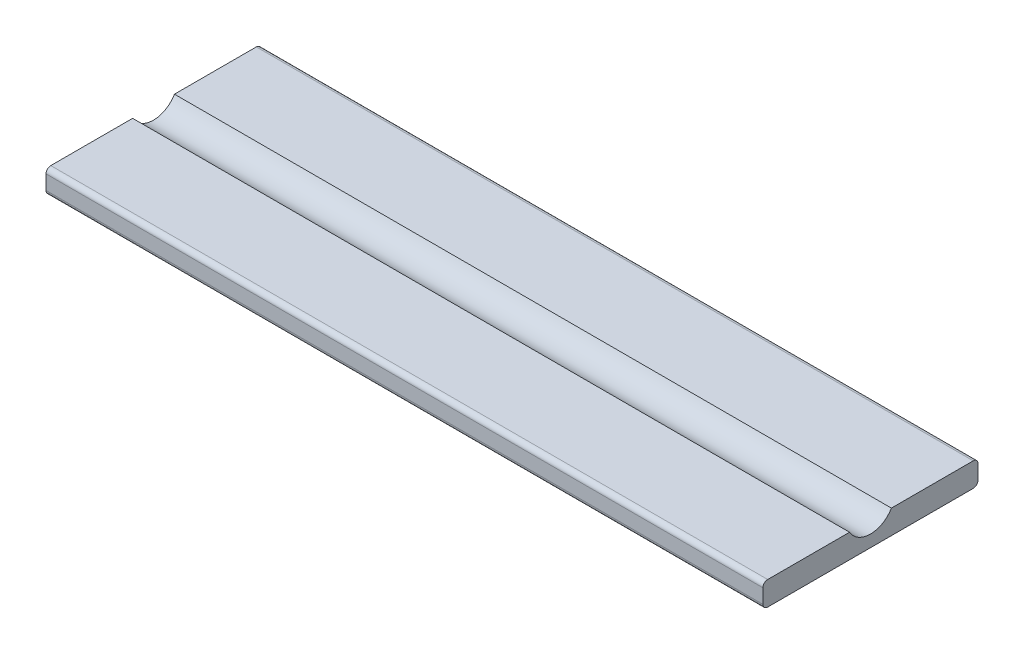
ISO-10303-21;
HEADER;
FILE_DESCRIPTION(('STEP AP214'),'2;1');
FILE_NAME('part.step','',(''),(''),'','','');
FILE_SCHEMA(('AUTOMOTIVE_DESIGN { 1 0 10303 214 1 1 1 1 }'));
ENDSEC;
DATA;
#1=APPLICATION_CONTEXT('core data for automotive mechanical design processes');
#2=APPLICATION_PROTOCOL_DEFINITION('international standard','automotive_design',2000,#1);
#3=PRODUCT_CONTEXT('',#1,'mechanical');
#4=PRODUCT('Part','Part','',(#3));
#5=PRODUCT_RELATED_PRODUCT_CATEGORY('part','',(#4));
#6=PRODUCT_DEFINITION_FORMATION('','',#4);
#7=PRODUCT_DEFINITION_CONTEXT('part definition',#1,'design');
#8=PRODUCT_DEFINITION('design','',#6,#7);
#9=PRODUCT_DEFINITION_SHAPE('','',#8);
#10=(LENGTH_UNIT() NAMED_UNIT(*) SI_UNIT(.MILLI.,.METRE.));
#11=(NAMED_UNIT(*) PLANE_ANGLE_UNIT() SI_UNIT($,.RADIAN.));
#12=(NAMED_UNIT(*) SI_UNIT($,.STERADIAN.) SOLID_ANGLE_UNIT());
#13=UNCERTAINTY_MEASURE_WITH_UNIT(LENGTH_MEASURE(1.E-05),#10,'distance_accuracy_value','');
#14=(GEOMETRIC_REPRESENTATION_CONTEXT(3) GLOBAL_UNCERTAINTY_ASSIGNED_CONTEXT((#13)) GLOBAL_UNIT_ASSIGNED_CONTEXT((#10,
#11,#12)) REPRESENTATION_CONTEXT('',''));
#15=CARTESIAN_POINT('',(0.,0.,0.));
#16=DIRECTION('',(0.,0.,1.));
#17=DIRECTION('',(1.,0.,0.));
#18=AXIS2_PLACEMENT_3D('',#15,#16,#17);
#19=CARTESIAN_POINT('',(47.625,0.,14.2875));
#20=DIRECTION('',(0.,0.,-1.));
#21=DIRECTION('',(-1.,0.,0.));
#22=AXIS2_PLACEMENT_3D('',#19,#20,#21);
#23=PLANE('',#22);
#24=DIRECTION('',(0.,-1.,0.));
#25=VECTOR('',#24,1.);
#26=CARTESIAN_POINT('',(-47.625,0.,14.2875));
#27=LINE('',#26,#25);
#28=CARTESIAN_POINT('',(-47.625,2.54,14.2875));
#29=VERTEX_POINT('',#28);
#30=CARTESIAN_POINT('',(-47.625,0.635,14.2875));
#31=VERTEX_POINT('',#30);
#32=EDGE_CURVE('E139',#29,#31,#27,.T.);
#33=ORIENTED_EDGE('',*,*,#32,.T.);
#34=DIRECTION('',(-1.,0.,0.));
#35=VECTOR('',#34,1.);
#36=CARTESIAN_POINT('',(47.625,0.635,14.2875));
#37=LINE('',#36,#35);
#38=CARTESIAN_POINT('',(47.625,0.635,14.2875));
#39=VERTEX_POINT('',#38);
#40=EDGE_CURVE('E43',#31,#39,#37,.F.);
#41=ORIENTED_EDGE('',*,*,#40,.T.);
#42=DIRECTION('',(0.,-1.,0.));
#43=VECTOR('',#42,1.);
#44=CARTESIAN_POINT('',(47.625,0.,14.2875));
#45=LINE('',#44,#43);
#46=CARTESIAN_POINT('',(47.625,2.54,14.2875));
#47=VERTEX_POINT('',#46);
#48=EDGE_CURVE('E153',#47,#39,#45,.T.);
#49=ORIENTED_EDGE('',*,*,#48,.F.);
#50=DIRECTION('',(-1.,0.,0.));
#51=VECTOR('',#50,1.);
#52=CARTESIAN_POINT('',(47.625,2.54,14.2875));
#53=LINE('',#52,#51);
#54=EDGE_CURVE('E181',#47,#29,#53,.T.);
#55=ORIENTED_EDGE('',*,*,#54,.T.);
#56=EDGE_LOOP('',(#33,#41,#49,#55));
#57=FACE_BOUND('',#56,.T.);
#58=ADVANCED_FACE('F35',(#57),#23,.F.);
#59=CARTESIAN_POINT('',(47.625,0.,14.2875));
#60=DIRECTION('',(0.,1.,0.));
#61=DIRECTION('',(0.,0.,1.));
#62=AXIS2_PLACEMENT_3D('',#59,#60,#61);
#63=PLANE('',#62);
#64=DIRECTION('',(0.,0.,-1.));
#65=VECTOR('',#64,1.);
#66=CARTESIAN_POINT('',(-47.625,0.,14.2875));
#67=LINE('',#66,#65);
#68=CARTESIAN_POINT('',(-47.625,0.,13.6525));
#69=VERTEX_POINT('',#68);
#70=CARTESIAN_POINT('',(-47.625,0.,-13.6525));
#71=VERTEX_POINT('',#70);
#72=EDGE_CURVE('E142',#69,#71,#67,.T.);
#73=ORIENTED_EDGE('',*,*,#72,.T.);
#74=DIRECTION('',(-1.,0.,0.));
#75=VECTOR('',#74,1.);
#76=CARTESIAN_POINT('',(47.625,0.,-13.6525));
#77=LINE('',#76,#75);
#78=CARTESIAN_POINT('',(47.625,0.,-13.6525));
#79=VERTEX_POINT('',#78);
#80=EDGE_CURVE('E170',#71,#79,#77,.F.);
#81=ORIENTED_EDGE('',*,*,#80,.T.);
#82=DIRECTION('',(0.,0.,-1.));
#83=VECTOR('',#82,1.);
#84=CARTESIAN_POINT('',(47.625,0.,14.2875));
#85=LINE('',#84,#83);
#86=CARTESIAN_POINT('',(47.625,0.,13.6525));
#87=VERTEX_POINT('',#86);
#88=EDGE_CURVE('E193',#87,#79,#85,.T.);
#89=ORIENTED_EDGE('',*,*,#88,.F.);
#90=DIRECTION('',(-1.,0.,0.));
#91=VECTOR('',#90,1.);
#92=CARTESIAN_POINT('',(47.625,0.,13.6525));
#93=LINE('',#92,#91);
#94=EDGE_CURVE('E167',#87,#69,#93,.T.);
#95=ORIENTED_EDGE('',*,*,#94,.T.);
#96=EDGE_LOOP('',(#73,#81,#89,#95));
#97=FACE_BOUND('',#96,.T.);
#98=ADVANCED_FACE('F199',(#97),#63,.F.);
#99=CARTESIAN_POINT('',(47.625,0.,-14.2875));
#100=DIRECTION('',(0.,0.,1.));
#101=DIRECTION('',(1.,0.,0.));
#102=AXIS2_PLACEMENT_3D('',#99,#100,#101);
#103=PLANE('',#102);
#104=DIRECTION('',(0.,1.,0.));
#105=VECTOR('',#104,1.);
#106=CARTESIAN_POINT('',(47.625,0.,-14.2875));
#107=LINE('',#106,#105);
#108=CARTESIAN_POINT('',(47.625,0.635,-14.2875));
#109=VERTEX_POINT('',#108);
#110=CARTESIAN_POINT('',(47.625,2.54,-14.2875));
#111=VERTEX_POINT('',#110);
#112=EDGE_CURVE('E120',#109,#111,#107,.T.);
#113=ORIENTED_EDGE('',*,*,#112,.F.);
#114=DIRECTION('',(-1.,0.,0.));
#115=VECTOR('',#114,1.);
#116=CARTESIAN_POINT('',(47.625,0.635,-14.2875));
#117=LINE('',#116,#115);
#118=CARTESIAN_POINT('',(-47.625,0.635,-14.2875));
#119=VERTEX_POINT('',#118);
#120=EDGE_CURVE('E156',#109,#119,#117,.T.);
#121=ORIENTED_EDGE('',*,*,#120,.T.);
#122=DIRECTION('',(0.,1.,0.));
#123=VECTOR('',#122,1.);
#124=CARTESIAN_POINT('',(-47.625,0.,-14.2875));
#125=LINE('',#124,#123);
#126=CARTESIAN_POINT('',(-47.625,2.54,-14.2875));
#127=VERTEX_POINT('',#126);
#128=EDGE_CURVE('E145',#119,#127,#125,.T.);
#129=ORIENTED_EDGE('',*,*,#128,.T.);
#130=DIRECTION('',(-1.,0.,0.));
#131=VECTOR('',#130,1.);
#132=CARTESIAN_POINT('',(47.625,2.54,-14.2875));
#133=LINE('',#132,#131);
#134=EDGE_CURVE('E129',#127,#111,#133,.F.);
#135=ORIENTED_EDGE('',*,*,#134,.T.);
#136=EDGE_LOOP('',(#113,#121,#129,#135));
#137=FACE_BOUND('',#136,.T.);
#138=ADVANCED_FACE('F210',(#137),#103,.F.);
#139=CARTESIAN_POINT('',(47.625,3.175,-2.778125));
#140=DIRECTION('',(0.,-1.,0.));
#141=DIRECTION('',(0.,0.,-1.));
#142=AXIS2_PLACEMENT_3D('',#139,#140,#141);
#143=PLANE('',#142);
#144=DIRECTION('',(0.,0.,1.));
#145=VECTOR('',#144,1.);
#146=CARTESIAN_POINT('',(47.625,3.175,-2.778125));
#147=LINE('',#146,#145);
#148=CARTESIAN_POINT('',(47.625,3.175,-13.6525));
#149=VERTEX_POINT('',#148);
#150=CARTESIAN_POINT('',(47.625,3.175,-2.778125));
#151=VERTEX_POINT('',#150);
#152=EDGE_CURVE('E110',#149,#151,#147,.T.);
#153=ORIENTED_EDGE('',*,*,#152,.F.);
#154=DIRECTION('',(-1.,0.,0.));
#155=VECTOR('',#154,1.);
#156=CARTESIAN_POINT('',(47.625,3.175,-13.6525));
#157=LINE('',#156,#155);
#158=CARTESIAN_POINT('',(-47.625,3.175,-13.6525));
#159=VERTEX_POINT('',#158);
#160=EDGE_CURVE('E179',#149,#159,#157,.T.);
#161=ORIENTED_EDGE('',*,*,#160,.T.);
#162=DIRECTION('',(0.,0.,1.));
#163=VECTOR('',#162,1.);
#164=CARTESIAN_POINT('',(-47.625,3.175,-2.778125));
#165=LINE('',#164,#163);
#166=CARTESIAN_POINT('',(-47.625,3.175,-2.778125));
#167=VERTEX_POINT('',#166);
#168=EDGE_CURVE('E126',#159,#167,#165,.T.);
#169=ORIENTED_EDGE('',*,*,#168,.T.);
#170=DIRECTION('',(-1.,0.,0.));
#171=VECTOR('',#170,1.);
#172=CARTESIAN_POINT('',(47.625,3.175,-2.778125));
#173=LINE('',#172,#171);
#174=EDGE_CURVE('E123',#151,#167,#173,.T.);
#175=ORIENTED_EDGE('',*,*,#174,.F.);
#176=EDGE_LOOP('',(#153,#161,#169,#175));
#177=FACE_BOUND('',#176,.T.);
#178=ADVANCED_FACE('F124',(#177),#143,.F.);
#179=CARTESIAN_POINT('',(47.625,4.78646684027778,0.));
#180=DIRECTION('',(-1.,0.,0.));
#181=DIRECTION('',(0.,0.,1.));
#182=AXIS2_PLACEMENT_3D('',#179,#180,#181);
#183=CYLINDRICAL_SURFACE('',#182,3.21166684027778);
#184=CARTESIAN_POINT('',(-47.625,4.78646684027778,0.));
#185=DIRECTION('',(-1.,0.,0.));
#186=DIRECTION('',(0.,0.,-1.));
#187=AXIS2_PLACEMENT_3D('',#184,#185,#186);
#188=CIRCLE('',#187,3.21166684027778);
#189=CARTESIAN_POINT('',(-47.625,3.175,2.778125));
#190=VERTEX_POINT('',#189);
#191=EDGE_CURVE('E149',#167,#190,#188,.T.);
#192=ORIENTED_EDGE('',*,*,#191,.T.);
#193=DIRECTION('',(-1.,0.,0.));
#194=VECTOR('',#193,1.);
#195=CARTESIAN_POINT('',(47.625,3.175,2.778125));
#196=LINE('',#195,#194);
#197=CARTESIAN_POINT('',(47.625,3.175,2.778125));
#198=VERTEX_POINT('',#197);
#199=EDGE_CURVE('E130',#198,#190,#196,.T.);
#200=ORIENTED_EDGE('',*,*,#199,.F.);
#201=CARTESIAN_POINT('',(47.625,4.78646684027778,0.));
#202=DIRECTION('',(-1.,0.,0.));
#203=DIRECTION('',(0.,0.,-1.));
#204=AXIS2_PLACEMENT_3D('',#201,#202,#203);
#205=CIRCLE('',#204,3.21166684027778);
#206=EDGE_CURVE('E115',#151,#198,#205,.T.);
#207=ORIENTED_EDGE('',*,*,#206,.F.);
#208=ORIENTED_EDGE('',*,*,#174,.T.);
#209=EDGE_LOOP('',(#192,#200,#207,#208));
#210=FACE_BOUND('',#209,.T.);
#211=ADVANCED_FACE('F132',(#210),#183,.F.);
#212=CARTESIAN_POINT('',(47.625,3.175,14.2875));
#213=DIRECTION('',(0.,-1.,0.));
#214=DIRECTION('',(0.,0.,-1.));
#215=AXIS2_PLACEMENT_3D('',#212,#213,#214);
#216=PLANE('',#215);
#217=DIRECTION('',(0.,0.,1.));
#218=VECTOR('',#217,1.);
#219=CARTESIAN_POINT('',(-47.625,3.175,14.2875));
#220=LINE('',#219,#218);
#221=CARTESIAN_POINT('',(-47.625,3.175,13.6525));
#222=VERTEX_POINT('',#221);
#223=EDGE_CURVE('E151',#190,#222,#220,.T.);
#224=ORIENTED_EDGE('',*,*,#223,.T.);
#225=DIRECTION('',(-1.,0.,0.));
#226=VECTOR('',#225,1.);
#227=CARTESIAN_POINT('',(47.625,3.175,13.6525));
#228=LINE('',#227,#226);
#229=CARTESIAN_POINT('',(47.625,3.175,13.6525));
#230=VERTEX_POINT('',#229);
#231=EDGE_CURVE('E11',#222,#230,#228,.F.);
#232=ORIENTED_EDGE('',*,*,#231,.T.);
#233=DIRECTION('',(0.,0.,1.));
#234=VECTOR('',#233,1.);
#235=CARTESIAN_POINT('',(47.625,3.175,14.2875));
#236=LINE('',#235,#234);
#237=EDGE_CURVE('E134',#198,#230,#236,.T.);
#238=ORIENTED_EDGE('',*,*,#237,.F.);
#239=ORIENTED_EDGE('',*,*,#199,.T.);
#240=EDGE_LOOP('',(#224,#232,#238,#239));
#241=FACE_BOUND('',#240,.T.);
#242=ADVANCED_FACE('F216',(#241),#216,.F.);
#243=CARTESIAN_POINT('',(47.625,4.78646684027778,0.));
#244=DIRECTION('',(1.,0.,0.));
#245=DIRECTION('',(0.,0.,-1.));
#246=AXIS2_PLACEMENT_3D('',#243,#244,#245);
#247=PLANE('',#246);
#248=ORIENTED_EDGE('',*,*,#88,.T.);
#249=CARTESIAN_POINT('',(47.625,0.635,-13.6525));
#250=DIRECTION('',(1.,0.,0.));
#251=DIRECTION('',(0.,0.,-1.));
#252=AXIS2_PLACEMENT_3D('',#249,#250,#251);
#253=CIRCLE('',#252,0.635);
#254=EDGE_CURVE('E177',#79,#109,#253,.T.);
#255=ORIENTED_EDGE('',*,*,#254,.T.);
#256=ORIENTED_EDGE('',*,*,#112,.T.);
#257=CARTESIAN_POINT('',(47.625,2.54,-13.6525));
#258=DIRECTION('',(1.,0.,0.));
#259=DIRECTION('',(0.,0.,-1.));
#260=AXIS2_PLACEMENT_3D('',#257,#258,#259);
#261=CIRCLE('',#260,0.635);
#262=EDGE_CURVE('E56',#111,#149,#261,.T.);
#263=ORIENTED_EDGE('',*,*,#262,.T.);
#264=ORIENTED_EDGE('',*,*,#152,.T.);
#265=ORIENTED_EDGE('',*,*,#206,.T.);
#266=ORIENTED_EDGE('',*,*,#237,.T.);
#267=CARTESIAN_POINT('',(47.625,2.54,13.6525));
#268=DIRECTION('',(1.,0.,0.));
#269=DIRECTION('',(0.,0.,-1.));
#270=AXIS2_PLACEMENT_3D('',#267,#268,#269);
#271=CIRCLE('',#270,0.635);
#272=EDGE_CURVE('E172',#230,#47,#271,.T.);
#273=ORIENTED_EDGE('',*,*,#272,.T.);
#274=ORIENTED_EDGE('',*,*,#48,.T.);
#275=CARTESIAN_POINT('',(47.625,0.635,13.6525));
#276=DIRECTION('',(1.,0.,0.));
#277=DIRECTION('',(0.,0.,-1.));
#278=AXIS2_PLACEMENT_3D('',#275,#276,#277);
#279=CIRCLE('',#278,0.635);
#280=EDGE_CURVE('E174',#39,#87,#279,.T.);
#281=ORIENTED_EDGE('',*,*,#280,.T.);
#282=EDGE_LOOP('',(#248,#255,#256,#263,#264,#265,#266,#273,#274,#281));
#283=FACE_BOUND('',#282,.T.);
#284=ADVANCED_FACE('F113',(#283),#247,.T.);
#285=CARTESIAN_POINT('',(-47.625,4.78646684027778,0.));
#286=DIRECTION('',(1.,0.,0.));
#287=DIRECTION('',(0.,0.,-1.));
#288=AXIS2_PLACEMENT_3D('',#285,#286,#287);
#289=PLANE('',#288);
#290=ORIENTED_EDGE('',*,*,#128,.F.);
#291=CARTESIAN_POINT('',(-47.625,0.635,-13.6525));
#292=DIRECTION('',(1.,0.,0.));
#293=DIRECTION('',(0.,0.,-1.));
#294=AXIS2_PLACEMENT_3D('',#291,#292,#293);
#295=CIRCLE('',#294,0.635);
#296=EDGE_CURVE('E165',#119,#71,#295,.F.);
#297=ORIENTED_EDGE('',*,*,#296,.T.);
#298=ORIENTED_EDGE('',*,*,#72,.F.);
#299=CARTESIAN_POINT('',(-47.625,0.635,13.6525));
#300=DIRECTION('',(1.,0.,0.));
#301=DIRECTION('',(0.,0.,-1.));
#302=AXIS2_PLACEMENT_3D('',#299,#300,#301);
#303=CIRCLE('',#302,0.635);
#304=EDGE_CURVE('E161',#69,#31,#303,.F.);
#305=ORIENTED_EDGE('',*,*,#304,.T.);
#306=ORIENTED_EDGE('',*,*,#32,.F.);
#307=CARTESIAN_POINT('',(-47.625,2.54,13.6525));
#308=DIRECTION('',(1.,0.,0.));
#309=DIRECTION('',(0.,0.,-1.));
#310=AXIS2_PLACEMENT_3D('',#307,#308,#309);
#311=CIRCLE('',#310,0.635);
#312=EDGE_CURVE('E159',#29,#222,#311,.F.);
#313=ORIENTED_EDGE('',*,*,#312,.T.);
#314=ORIENTED_EDGE('',*,*,#223,.F.);
#315=ORIENTED_EDGE('',*,*,#191,.F.);
#316=ORIENTED_EDGE('',*,*,#168,.F.);
#317=CARTESIAN_POINT('',(-47.625,2.54,-13.6525));
#318=DIRECTION('',(1.,0.,0.));
#319=DIRECTION('',(0.,0.,-1.));
#320=AXIS2_PLACEMENT_3D('',#317,#318,#319);
#321=CIRCLE('',#320,0.635);
#322=EDGE_CURVE('E163',#159,#127,#321,.F.);
#323=ORIENTED_EDGE('',*,*,#322,.T.);
#324=EDGE_LOOP('',(#290,#297,#298,#305,#306,#313,#314,#315,#316,#323));
#325=FACE_BOUND('',#324,.T.);
#326=ADVANCED_FACE('F203',(#325),#289,.F.);
#327=CARTESIAN_POINT('',(47.625,0.635,-13.6525));
#328=DIRECTION('',(-1.,0.,0.));
#329=DIRECTION('',(0.,0.,1.));
#330=AXIS2_PLACEMENT_3D('',#327,#328,#329);
#331=CYLINDRICAL_SURFACE('',#330,0.635);
#332=ORIENTED_EDGE('',*,*,#254,.F.);
#333=ORIENTED_EDGE('',*,*,#80,.F.);
#334=ORIENTED_EDGE('',*,*,#296,.F.);
#335=ORIENTED_EDGE('',*,*,#120,.F.);
#336=EDGE_LOOP('',(#332,#333,#334,#335));
#337=FACE_BOUND('',#336,.T.);
#338=ADVANCED_FACE('F207',(#337),#331,.T.);
#339=CARTESIAN_POINT('',(47.625,2.54,-13.6525));
#340=DIRECTION('',(-1.,0.,0.));
#341=DIRECTION('',(0.,0.,1.));
#342=AXIS2_PLACEMENT_3D('',#339,#340,#341);
#343=CYLINDRICAL_SURFACE('',#342,0.635);
#344=ORIENTED_EDGE('',*,*,#262,.F.);
#345=ORIENTED_EDGE('',*,*,#134,.F.);
#346=ORIENTED_EDGE('',*,*,#322,.F.);
#347=ORIENTED_EDGE('',*,*,#160,.F.);
#348=EDGE_LOOP('',(#344,#345,#346,#347));
#349=FACE_BOUND('',#348,.T.);
#350=ADVANCED_FACE('F214',(#349),#343,.T.);
#351=CARTESIAN_POINT('',(47.625,0.635,13.6525));
#352=DIRECTION('',(-1.,0.,0.));
#353=DIRECTION('',(0.,0.,1.));
#354=AXIS2_PLACEMENT_3D('',#351,#352,#353);
#355=CYLINDRICAL_SURFACE('',#354,0.635);
#356=ORIENTED_EDGE('',*,*,#280,.F.);
#357=ORIENTED_EDGE('',*,*,#40,.F.);
#358=ORIENTED_EDGE('',*,*,#304,.F.);
#359=ORIENTED_EDGE('',*,*,#94,.F.);
#360=EDGE_LOOP('',(#356,#357,#358,#359));
#361=FACE_BOUND('',#360,.T.);
#362=ADVANCED_FACE('F196',(#361),#355,.T.);
#363=CARTESIAN_POINT('',(47.625,2.54,13.6525));
#364=DIRECTION('',(-1.,0.,0.));
#365=DIRECTION('',(0.,0.,1.));
#366=AXIS2_PLACEMENT_3D('',#363,#364,#365);
#367=CYLINDRICAL_SURFACE('',#366,0.635);
#368=ORIENTED_EDGE('',*,*,#272,.F.);
#369=ORIENTED_EDGE('',*,*,#231,.F.);
#370=ORIENTED_EDGE('',*,*,#312,.F.);
#371=ORIENTED_EDGE('',*,*,#54,.F.);
#372=EDGE_LOOP('',(#368,#369,#370,#371));
#373=FACE_BOUND('',#372,.T.);
#374=ADVANCED_FACE('F37',(#373),#367,.T.);
#375=CLOSED_SHELL('',(#58,#98,#138,#178,#211,#242,#284,#326,#338,#350,#362,#374));
#376=MANIFOLD_SOLID_BREP('B2',#375);
#377=ADVANCED_BREP_SHAPE_REPRESENTATION('',(#18,#376),#14);
#378=SHAPE_DEFINITION_REPRESENTATION(#9,#377);
ENDSEC;
END-ISO-10303-21;
